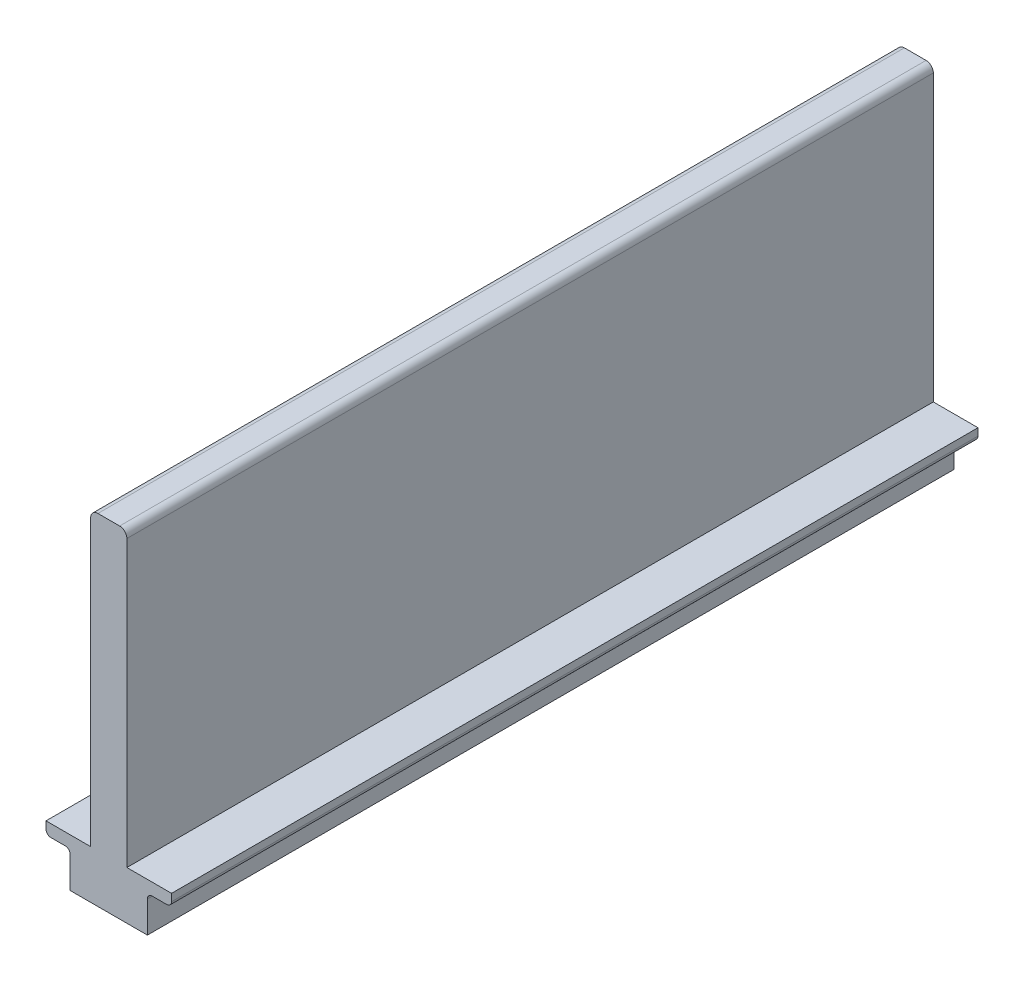
ISO-10303-21;
HEADER;
FILE_DESCRIPTION(('STEP AP214'),'2;1');
FILE_NAME('part.step','',(''),(''),'','','');
FILE_SCHEMA(('AUTOMOTIVE_DESIGN { 1 0 10303 214 1 1 1 1 }'));
ENDSEC;
DATA;
#1=APPLICATION_CONTEXT('core data for automotive mechanical design processes');
#2=APPLICATION_PROTOCOL_DEFINITION('international standard','automotive_design',2000,#1);
#3=PRODUCT_CONTEXT('',#1,'mechanical');
#4=PRODUCT('Part','Part','',(#3));
#5=PRODUCT_RELATED_PRODUCT_CATEGORY('part','',(#4));
#6=PRODUCT_DEFINITION_FORMATION('','',#4);
#7=PRODUCT_DEFINITION_CONTEXT('part definition',#1,'design');
#8=PRODUCT_DEFINITION('design','',#6,#7);
#9=PRODUCT_DEFINITION_SHAPE('','',#8);
#10=(LENGTH_UNIT() NAMED_UNIT(*) SI_UNIT(.MILLI.,.METRE.));
#11=(NAMED_UNIT(*) PLANE_ANGLE_UNIT() SI_UNIT($,.RADIAN.));
#12=(NAMED_UNIT(*) SI_UNIT($,.STERADIAN.) SOLID_ANGLE_UNIT());
#13=UNCERTAINTY_MEASURE_WITH_UNIT(LENGTH_MEASURE(1.E-05),#10,'distance_accuracy_value','');
#14=(GEOMETRIC_REPRESENTATION_CONTEXT(3) GLOBAL_UNCERTAINTY_ASSIGNED_CONTEXT((#13)) GLOBAL_UNIT_ASSIGNED_CONTEXT((#10,
#11,#12)) REPRESENTATION_CONTEXT('',''));
#15=CARTESIAN_POINT('',(0.,0.,0.));
#16=DIRECTION('',(0.,0.,1.));
#17=DIRECTION('',(1.,0.,0.));
#18=AXIS2_PLACEMENT_3D('',#15,#16,#17);
#19=CARTESIAN_POINT('',(-4.191,-0.762,84.981564660483));
#20=DIRECTION('',(0.,0.,-1.));
#21=DIRECTION('',(-1.,0.,0.));
#22=AXIS2_PLACEMENT_3D('',#19,#20,#21);
#23=CYLINDRICAL_SURFACE('',#22,0.508);
#24=CARTESIAN_POINT('',(-4.191,-0.762,84.836));
#25=DIRECTION('',(0.,0.,-1.));
#26=DIRECTION('',(-1.,0.,0.));
#27=AXIS2_PLACEMENT_3D('',#24,#25,#26);
#28=CIRCLE('',#27,0.508);
#29=CARTESIAN_POINT('',(-4.191,-1.27,84.836));
#30=VERTEX_POINT('',#29);
#31=CARTESIAN_POINT('',(-4.699,-0.762,84.836));
#32=VERTEX_POINT('',#31);
#33=EDGE_CURVE('E127',#30,#32,#28,.T.);
#34=ORIENTED_EDGE('',*,*,#33,.T.);
#35=DIRECTION('',(0.,0.,1.));
#36=VECTOR('',#35,1.);
#37=CARTESIAN_POINT('',(-4.699,-0.762,0.));
#38=LINE('',#37,#36);
#39=CARTESIAN_POINT('',(-4.699,-0.762,0.));
#40=VERTEX_POINT('',#39);
#41=EDGE_CURVE('E130',#40,#32,#38,.T.);
#42=ORIENTED_EDGE('',*,*,#41,.F.);
#43=CARTESIAN_POINT('',(-4.191,-0.762,0.));
#44=DIRECTION('',(0.,0.,-1.));
#45=DIRECTION('',(-1.,0.,0.));
#46=AXIS2_PLACEMENT_3D('',#43,#44,#45);
#47=CIRCLE('',#46,0.508);
#48=CARTESIAN_POINT('',(-4.191,-1.27,0.));
#49=VERTEX_POINT('',#48);
#50=EDGE_CURVE('E20',#40,#49,#47,.F.);
#51=ORIENTED_EDGE('',*,*,#50,.T.);
#52=DIRECTION('',(0.,0.,-1.));
#53=VECTOR('',#52,1.);
#54=CARTESIAN_POINT('',(-4.191,-1.27,0.));
#55=LINE('',#54,#53);
#56=EDGE_CURVE('E157',#30,#49,#55,.T.);
#57=ORIENTED_EDGE('',*,*,#56,.F.);
#58=EDGE_LOOP('',(#34,#42,#51,#57));
#59=FACE_BOUND('',#58,.T.);
#60=ADVANCED_FACE('F17',(#59),#23,.T.);
#61=CARTESIAN_POINT('',(-4.699,-1.27,0.));
#62=DIRECTION('',(0.,-1.,0.));
#63=DIRECTION('',(0.,0.,-1.));
#64=AXIS2_PLACEMENT_3D('',#61,#62,#63);
#65=PLANE('',#64);
#66=DIRECTION('',(1.,0.,0.));
#67=VECTOR('',#66,1.);
#68=CARTESIAN_POINT('',(-4.699,-1.27,84.836));
#69=LINE('',#68,#67);
#70=CARTESIAN_POINT('',(-2.667,-1.27,84.836));
#71=VERTEX_POINT('',#70);
#72=EDGE_CURVE('E160',#71,#30,#69,.F.);
#73=ORIENTED_EDGE('',*,*,#72,.T.);
#74=ORIENTED_EDGE('',*,*,#56,.T.);
#75=DIRECTION('',(1.,0.,0.));
#76=VECTOR('',#75,1.);
#77=CARTESIAN_POINT('',(-4.699,-1.27,0.));
#78=LINE('',#77,#76);
#79=CARTESIAN_POINT('',(-2.667,-1.27,0.));
#80=VERTEX_POINT('',#79);
#81=EDGE_CURVE('E123',#49,#80,#78,.T.);
#82=ORIENTED_EDGE('',*,*,#81,.T.);
#83=DIRECTION('',(0.,0.,1.));
#84=VECTOR('',#83,1.);
#85=CARTESIAN_POINT('',(-2.667,-1.27,-0.124377411582246));
#86=LINE('',#85,#84);
#87=EDGE_CURVE('E181',#80,#71,#86,.T.);
#88=ORIENTED_EDGE('',*,*,#87,.T.);
#89=EDGE_LOOP('',(#73,#74,#82,#88));
#90=FACE_BOUND('',#89,.T.);
#91=ADVANCED_FACE('F370',(#90),#65,.T.);
#92=CARTESIAN_POINT('',(5.969,-1.27,0.));
#93=DIRECTION('',(0.,-1.,0.));
#94=DIRECTION('',(0.,0.,-1.));
#95=AXIS2_PLACEMENT_3D('',#92,#93,#94);
#96=PLANE('',#95);
#97=DIRECTION('',(1.,0.,0.));
#98=VECTOR('',#97,1.);
#99=CARTESIAN_POINT('',(5.969,-1.27,0.));
#100=LINE('',#99,#98);
#101=CARTESIAN_POINT('',(6.477,-1.27,0.));
#102=VERTEX_POINT('',#101);
#103=CARTESIAN_POINT('',(8.001,-1.27,0.));
#104=VERTEX_POINT('',#103);
#105=EDGE_CURVE('E187',#102,#104,#100,.T.);
#106=ORIENTED_EDGE('',*,*,#105,.T.);
#107=DIRECTION('',(0.,0.,-1.));
#108=VECTOR('',#107,1.);
#109=CARTESIAN_POINT('',(8.001,-1.27,84.981564660483));
#110=LINE('',#109,#108);
#111=CARTESIAN_POINT('',(8.001,-1.27,84.836));
#112=VERTEX_POINT('',#111);
#113=EDGE_CURVE('E141',#112,#104,#110,.T.);
#114=ORIENTED_EDGE('',*,*,#113,.F.);
#115=DIRECTION('',(1.,0.,0.));
#116=VECTOR('',#115,1.);
#117=CARTESIAN_POINT('',(5.969,-1.27,84.836));
#118=LINE('',#117,#116);
#119=CARTESIAN_POINT('',(6.477,-1.27,84.836));
#120=VERTEX_POINT('',#119);
#121=EDGE_CURVE('E159',#112,#120,#118,.F.);
#122=ORIENTED_EDGE('',*,*,#121,.T.);
#123=DIRECTION('',(0.,0.,1.));
#124=VECTOR('',#123,1.);
#125=CARTESIAN_POINT('',(6.477,-1.27,-0.124377411582246));
#126=LINE('',#125,#124);
#127=EDGE_CURVE('E178',#120,#102,#126,.F.);
#128=ORIENTED_EDGE('',*,*,#127,.T.);
#129=EDGE_LOOP('',(#106,#114,#122,#128));
#130=FACE_BOUND('',#129,.T.);
#131=ADVANCED_FACE('F385',(#130),#96,.T.);
#132=CARTESIAN_POINT('',(8.001,-0.762,84.981564660483));
#133=DIRECTION('',(0.,0.,-1.));
#134=DIRECTION('',(-1.,0.,0.));
#135=AXIS2_PLACEMENT_3D('',#132,#133,#134);
#136=CYLINDRICAL_SURFACE('',#135,0.508);
#137=CARTESIAN_POINT('',(8.001,-0.762,84.836));
#138=DIRECTION('',(0.,0.,-1.));
#139=DIRECTION('',(-1.,0.,0.));
#140=AXIS2_PLACEMENT_3D('',#137,#138,#139);
#141=CIRCLE('',#140,0.508);
#142=CARTESIAN_POINT('',(8.509,-0.762,84.836));
#143=VERTEX_POINT('',#142);
#144=EDGE_CURVE('E156',#143,#112,#141,.T.);
#145=ORIENTED_EDGE('',*,*,#144,.T.);
#146=ORIENTED_EDGE('',*,*,#113,.T.);
#147=CARTESIAN_POINT('',(8.001,-0.762,0.));
#148=DIRECTION('',(0.,0.,-1.));
#149=DIRECTION('',(-1.,0.,0.));
#150=AXIS2_PLACEMENT_3D('',#147,#148,#149);
#151=CIRCLE('',#150,0.508);
#152=CARTESIAN_POINT('',(8.509,-0.762,0.));
#153=VERTEX_POINT('',#152);
#154=EDGE_CURVE('E185',#104,#153,#151,.F.);
#155=ORIENTED_EDGE('',*,*,#154,.T.);
#156=DIRECTION('',(0.,0.,-1.));
#157=VECTOR('',#156,1.);
#158=CARTESIAN_POINT('',(8.509,-0.762,0.));
#159=LINE('',#158,#157);
#160=EDGE_CURVE('E213',#143,#153,#159,.T.);
#161=ORIENTED_EDGE('',*,*,#160,.F.);
#162=EDGE_LOOP('',(#145,#146,#155,#161));
#163=FACE_BOUND('',#162,.T.);
#164=ADVANCED_FACE('F388',(#163),#136,.T.);
#165=CARTESIAN_POINT('',(-4.699,0.,0.));
#166=DIRECTION('',(-1.,0.,0.));
#167=DIRECTION('',(0.,0.,1.));
#168=AXIS2_PLACEMENT_3D('',#165,#166,#167);
#169=PLANE('',#168);
#170=DIRECTION('',(0.,1.,0.));
#171=VECTOR('',#170,1.);
#172=CARTESIAN_POINT('',(-4.699,0.,0.));
#173=LINE('',#172,#171);
#174=CARTESIAN_POINT('',(-4.699,0.,0.));
#175=VERTEX_POINT('',#174);
#176=EDGE_CURVE('E120',#175,#40,#173,.F.);
#177=ORIENTED_EDGE('',*,*,#176,.T.);
#178=ORIENTED_EDGE('',*,*,#41,.T.);
#179=DIRECTION('',(0.,1.,0.));
#180=VECTOR('',#179,1.);
#181=CARTESIAN_POINT('',(-4.699,0.,84.836));
#182=LINE('',#181,#180);
#183=CARTESIAN_POINT('',(-4.699,0.,84.836));
#184=VERTEX_POINT('',#183);
#185=EDGE_CURVE('E139',#32,#184,#182,.T.);
#186=ORIENTED_EDGE('',*,*,#185,.T.);
#187=DIRECTION('',(0.,0.,1.));
#188=VECTOR('',#187,1.);
#189=CARTESIAN_POINT('',(-4.699,0.,0.));
#190=LINE('',#189,#188);
#191=EDGE_CURVE('E137',#175,#184,#190,.T.);
#192=ORIENTED_EDGE('',*,*,#191,.F.);
#193=EDGE_LOOP('',(#177,#178,#186,#192));
#194=FACE_BOUND('',#193,.T.);
#195=ADVANCED_FACE('F135',(#194),#169,.T.);
#196=CARTESIAN_POINT('',(-2.667,-1.778,-0.124377411582246));
#197=DIRECTION('',(0.,0.,1.));
#198=DIRECTION('',(1.,0.,0.));
#199=AXIS2_PLACEMENT_3D('',#196,#197,#198);
#200=CYLINDRICAL_SURFACE('',#199,0.508);
#201=ORIENTED_EDGE('',*,*,#87,.F.);
#202=CARTESIAN_POINT('',(-2.667,-1.778,0.));
#203=DIRECTION('',(0.,0.,1.));
#204=DIRECTION('',(1.,0.,0.));
#205=AXIS2_PLACEMENT_3D('',#202,#203,#204);
#206=CIRCLE('',#205,0.508);
#207=CARTESIAN_POINT('',(-2.159,-1.778,0.));
#208=VERTEX_POINT('',#207);
#209=EDGE_CURVE('E133',#208,#80,#206,.T.);
#210=ORIENTED_EDGE('',*,*,#209,.F.);
#211=DIRECTION('',(0.,0.,1.));
#212=VECTOR('',#211,1.);
#213=CARTESIAN_POINT('',(-2.159,-1.778,0.));
#214=LINE('',#213,#212);
#215=CARTESIAN_POINT('',(-2.159,-1.778,84.836));
#216=VERTEX_POINT('',#215);
#217=EDGE_CURVE('E235',#216,#208,#214,.F.);
#218=ORIENTED_EDGE('',*,*,#217,.F.);
#219=CARTESIAN_POINT('',(-2.667,-1.778,84.836));
#220=DIRECTION('',(0.,0.,1.));
#221=DIRECTION('',(1.,0.,0.));
#222=AXIS2_PLACEMENT_3D('',#219,#220,#221);
#223=CIRCLE('',#222,0.508);
#224=EDGE_CURVE('E179',#71,#216,#223,.F.);
#225=ORIENTED_EDGE('',*,*,#224,.F.);
#226=EDGE_LOOP('',(#201,#210,#218,#225));
#227=FACE_BOUND('',#226,.T.);
#228=ADVANCED_FACE('F374',(#227),#200,.F.);
#229=CARTESIAN_POINT('',(6.477,-1.778,-0.124377411582246));
#230=DIRECTION('',(0.,0.,1.));
#231=DIRECTION('',(1.,0.,0.));
#232=AXIS2_PLACEMENT_3D('',#229,#230,#231);
#233=CYLINDRICAL_SURFACE('',#232,0.508);
#234=DIRECTION('',(0.,0.,-1.));
#235=VECTOR('',#234,1.);
#236=CARTESIAN_POINT('',(5.969,-1.778,0.));
#237=LINE('',#236,#235);
#238=CARTESIAN_POINT('',(5.969,-1.778,0.));
#239=VERTEX_POINT('',#238);
#240=CARTESIAN_POINT('',(5.969,-1.778,84.836));
#241=VERTEX_POINT('',#240);
#242=EDGE_CURVE('E224',#239,#241,#237,.F.);
#243=ORIENTED_EDGE('',*,*,#242,.F.);
#244=CARTESIAN_POINT('',(6.477,-1.778,0.));
#245=DIRECTION('',(0.,0.,1.));
#246=DIRECTION('',(1.,0.,0.));
#247=AXIS2_PLACEMENT_3D('',#244,#245,#246);
#248=CIRCLE('',#247,0.508);
#249=EDGE_CURVE('E176',#102,#239,#248,.T.);
#250=ORIENTED_EDGE('',*,*,#249,.F.);
#251=ORIENTED_EDGE('',*,*,#127,.F.);
#252=CARTESIAN_POINT('',(6.477,-1.778,84.836));
#253=DIRECTION('',(0.,0.,1.));
#254=DIRECTION('',(1.,0.,0.));
#255=AXIS2_PLACEMENT_3D('',#252,#253,#254);
#256=CIRCLE('',#255,0.508);
#257=EDGE_CURVE('E173',#241,#120,#256,.F.);
#258=ORIENTED_EDGE('',*,*,#257,.F.);
#259=EDGE_LOOP('',(#243,#250,#251,#258));
#260=FACE_BOUND('',#259,.T.);
#261=ADVANCED_FACE('F383',(#260),#233,.F.);
#262=CARTESIAN_POINT('',(0.762,29.972,84.9850274449214));
#263=DIRECTION('',(0.,0.,-1.));
#264=DIRECTION('',(-1.,0.,0.));
#265=AXIS2_PLACEMENT_3D('',#262,#263,#264);
#266=CYLINDRICAL_SURFACE('',#265,0.762);
#267=CARTESIAN_POINT('',(0.762,29.972,84.836));
#268=DIRECTION('',(0.,0.,-1.));
#269=DIRECTION('',(-1.,0.,0.));
#270=AXIS2_PLACEMENT_3D('',#267,#268,#269);
#271=CIRCLE('',#270,0.762);
#272=CARTESIAN_POINT('',(0.,29.972,84.836));
#273=VERTEX_POINT('',#272);
#274=CARTESIAN_POINT('',(0.762,30.734,84.836));
#275=VERTEX_POINT('',#274);
#276=EDGE_CURVE('E168',#273,#275,#271,.T.);
#277=ORIENTED_EDGE('',*,*,#276,.T.);
#278=DIRECTION('',(0.,0.,1.));
#279=VECTOR('',#278,1.);
#280=CARTESIAN_POINT('',(0.762,30.734,0.));
#281=LINE('',#280,#279);
#282=CARTESIAN_POINT('',(0.762,30.734,0.));
#283=VERTEX_POINT('',#282);
#284=EDGE_CURVE('E220',#283,#275,#281,.T.);
#285=ORIENTED_EDGE('',*,*,#284,.F.);
#286=CARTESIAN_POINT('',(0.762,29.972,0.));
#287=DIRECTION('',(0.,0.,-1.));
#288=DIRECTION('',(-1.,0.,0.));
#289=AXIS2_PLACEMENT_3D('',#286,#287,#288);
#290=CIRCLE('',#289,0.762);
#291=CARTESIAN_POINT('',(0.,29.972,0.));
#292=VERTEX_POINT('',#291);
#293=EDGE_CURVE('E171',#283,#292,#290,.F.);
#294=ORIENTED_EDGE('',*,*,#293,.T.);
#295=DIRECTION('',(0.,0.,1.));
#296=VECTOR('',#295,1.);
#297=CARTESIAN_POINT('',(0.,29.972,0.));
#298=LINE('',#297,#296);
#299=EDGE_CURVE('E149',#273,#292,#298,.F.);
#300=ORIENTED_EDGE('',*,*,#299,.F.);
#301=EDGE_LOOP('',(#277,#285,#294,#300));
#302=FACE_BOUND('',#301,.T.);
#303=ADVANCED_FACE('F363',(#302),#266,.T.);
#304=CARTESIAN_POINT('',(8.509,-1.27,0.));
#305=DIRECTION('',(1.,0.,0.));
#306=DIRECTION('',(0.,0.,-1.));
#307=AXIS2_PLACEMENT_3D('',#304,#305,#306);
#308=PLANE('',#307);
#309=DIRECTION('',(0.,1.,0.));
#310=VECTOR('',#309,1.);
#311=CARTESIAN_POINT('',(8.509,0.,84.836));
#312=LINE('',#311,#310);
#313=CARTESIAN_POINT('',(8.509,0.,84.836));
#314=VERTEX_POINT('',#313);
#315=EDGE_CURVE('E281',#143,#314,#312,.T.);
#316=ORIENTED_EDGE('',*,*,#315,.F.);
#317=ORIENTED_EDGE('',*,*,#160,.T.);
#318=DIRECTION('',(0.,1.,0.));
#319=VECTOR('',#318,1.);
#320=CARTESIAN_POINT('',(8.509,-1.27,0.));
#321=LINE('',#320,#319);
#322=CARTESIAN_POINT('',(8.509,0.,0.));
#323=VERTEX_POINT('',#322);
#324=EDGE_CURVE('E170',#153,#323,#321,.T.);
#325=ORIENTED_EDGE('',*,*,#324,.T.);
#326=DIRECTION('',(0.,0.,1.));
#327=VECTOR('',#326,1.);
#328=CARTESIAN_POINT('',(8.509,0.,0.));
#329=LINE('',#328,#327);
#330=EDGE_CURVE('E260',#314,#323,#329,.F.);
#331=ORIENTED_EDGE('',*,*,#330,.F.);
#332=EDGE_LOOP('',(#316,#317,#325,#331));
#333=FACE_BOUND('',#332,.T.);
#334=ADVANCED_FACE('F390',(#333),#308,.T.);
#335=CARTESIAN_POINT('',(0.,30.734,0.));
#336=DIRECTION('',(-1.,0.,0.));
#337=DIRECTION('',(0.,0.,1.));
#338=AXIS2_PLACEMENT_3D('',#335,#336,#337);
#339=PLANE('',#338);
#340=DIRECTION('',(0.,1.,0.));
#341=VECTOR('',#340,1.);
#342=CARTESIAN_POINT('',(0.,0.,84.836));
#343=LINE('',#342,#341);
#344=CARTESIAN_POINT('',(0.,0.,84.836));
#345=VERTEX_POINT('',#344);
#346=EDGE_CURVE('E206',#273,#345,#343,.F.);
#347=ORIENTED_EDGE('',*,*,#346,.F.);
#348=ORIENTED_EDGE('',*,*,#299,.T.);
#349=DIRECTION('',(0.,1.,0.));
#350=VECTOR('',#349,1.);
#351=CARTESIAN_POINT('',(0.,0.,0.));
#352=LINE('',#351,#350);
#353=CARTESIAN_POINT('',(0.,0.,0.));
#354=VERTEX_POINT('',#353);
#355=EDGE_CURVE('E230',#292,#354,#352,.F.);
#356=ORIENTED_EDGE('',*,*,#355,.T.);
#357=DIRECTION('',(0.,0.,1.));
#358=VECTOR('',#357,1.);
#359=CARTESIAN_POINT('',(0.,0.,0.));
#360=LINE('',#359,#358);
#361=EDGE_CURVE('E148',#345,#354,#360,.F.);
#362=ORIENTED_EDGE('',*,*,#361,.F.);
#363=EDGE_LOOP('',(#347,#348,#356,#362));
#364=FACE_BOUND('',#363,.T.);
#365=ADVANCED_FACE('F366',(#364),#339,.T.);
#366=CARTESIAN_POINT('',(0.,0.,0.));
#367=DIRECTION('',(0.,1.,0.));
#368=DIRECTION('',(0.,0.,1.));
#369=AXIS2_PLACEMENT_3D('',#366,#367,#368);
#370=PLANE('',#369);
#371=ORIENTED_EDGE('',*,*,#361,.T.);
#372=DIRECTION('',(1.,0.,0.));
#373=VECTOR('',#372,1.);
#374=CARTESIAN_POINT('',(0.,0.,0.));
#375=LINE('',#374,#373);
#376=EDGE_CURVE('E227',#354,#175,#375,.F.);
#377=ORIENTED_EDGE('',*,*,#376,.T.);
#378=ORIENTED_EDGE('',*,*,#191,.T.);
#379=DIRECTION('',(1.,0.,0.));
#380=VECTOR('',#379,1.);
#381=CARTESIAN_POINT('',(0.,0.,84.836));
#382=LINE('',#381,#380);
#383=EDGE_CURVE('E202',#345,#184,#382,.F.);
#384=ORIENTED_EDGE('',*,*,#383,.F.);
#385=EDGE_LOOP('',(#371,#377,#378,#384));
#386=FACE_BOUND('',#385,.T.);
#387=ADVANCED_FACE('F369',(#386),#370,.T.);
#388=CARTESIAN_POINT('',(-2.159,-1.27,0.));
#389=DIRECTION('',(-1.,0.,0.));
#390=DIRECTION('',(0.,0.,1.));
#391=AXIS2_PLACEMENT_3D('',#388,#389,#390);
#392=PLANE('',#391);
#393=DIRECTION('',(0.,1.,0.));
#394=VECTOR('',#393,1.);
#395=CARTESIAN_POINT('',(-2.159,0.,84.836));
#396=LINE('',#395,#394);
#397=CARTESIAN_POINT('',(-2.159,-5.08,84.836));
#398=VERTEX_POINT('',#397);
#399=EDGE_CURVE('E205',#216,#398,#396,.F.);
#400=ORIENTED_EDGE('',*,*,#399,.F.);
#401=ORIENTED_EDGE('',*,*,#217,.T.);
#402=DIRECTION('',(0.,1.,0.));
#403=VECTOR('',#402,1.);
#404=CARTESIAN_POINT('',(-2.159,0.,0.));
#405=LINE('',#404,#403);
#406=CARTESIAN_POINT('',(-2.159,-5.08,0.));
#407=VERTEX_POINT('',#406);
#408=EDGE_CURVE('E229',#208,#407,#405,.F.);
#409=ORIENTED_EDGE('',*,*,#408,.T.);
#410=DIRECTION('',(0.,0.,-1.));
#411=VECTOR('',#410,1.);
#412=CARTESIAN_POINT('',(-2.159,-5.08,0.));
#413=LINE('',#412,#411);
#414=EDGE_CURVE('E240',#398,#407,#413,.T.);
#415=ORIENTED_EDGE('',*,*,#414,.F.);
#416=EDGE_LOOP('',(#400,#401,#409,#415));
#417=FACE_BOUND('',#416,.T.);
#418=ADVANCED_FACE('F378',(#417),#392,.T.);
#419=CARTESIAN_POINT('',(-2.159,-5.08,0.));
#420=DIRECTION('',(0.,-1.,0.));
#421=DIRECTION('',(0.,0.,-1.));
#422=AXIS2_PLACEMENT_3D('',#419,#420,#421);
#423=PLANE('',#422);
#424=ORIENTED_EDGE('',*,*,#414,.T.);
#425=DIRECTION('',(1.,0.,0.));
#426=VECTOR('',#425,1.);
#427=CARTESIAN_POINT('',(0.,-5.08,0.));
#428=LINE('',#427,#426);
#429=CARTESIAN_POINT('',(5.969,-5.08,0.));
#430=VERTEX_POINT('',#429);
#431=EDGE_CURVE('E248',#407,#430,#428,.T.);
#432=ORIENTED_EDGE('',*,*,#431,.T.);
#433=DIRECTION('',(0.,0.,-1.));
#434=VECTOR('',#433,1.);
#435=CARTESIAN_POINT('',(5.969,-5.08,0.));
#436=LINE('',#435,#434);
#437=CARTESIAN_POINT('',(5.969,-5.08,84.836));
#438=VERTEX_POINT('',#437);
#439=EDGE_CURVE('E245',#438,#430,#436,.T.);
#440=ORIENTED_EDGE('',*,*,#439,.F.);
#441=DIRECTION('',(1.,0.,0.));
#442=VECTOR('',#441,1.);
#443=CARTESIAN_POINT('',(0.,-5.08,84.836));
#444=LINE('',#443,#442);
#445=EDGE_CURVE('E209',#398,#438,#444,.T.);
#446=ORIENTED_EDGE('',*,*,#445,.F.);
#447=EDGE_LOOP('',(#424,#432,#440,#446));
#448=FACE_BOUND('',#447,.T.);
#449=ADVANCED_FACE('F379',(#448),#423,.T.);
#450=CARTESIAN_POINT('',(5.969,-5.08,0.));
#451=DIRECTION('',(1.,0.,0.));
#452=DIRECTION('',(0.,0.,-1.));
#453=AXIS2_PLACEMENT_3D('',#450,#451,#452);
#454=PLANE('',#453);
#455=DIRECTION('',(0.,1.,0.));
#456=VECTOR('',#455,1.);
#457=CARTESIAN_POINT('',(5.969,0.,0.));
#458=LINE('',#457,#456);
#459=EDGE_CURVE('E251',#430,#239,#458,.T.);
#460=ORIENTED_EDGE('',*,*,#459,.T.);
#461=ORIENTED_EDGE('',*,*,#242,.T.);
#462=DIRECTION('',(0.,1.,0.));
#463=VECTOR('',#462,1.);
#464=CARTESIAN_POINT('',(5.969,0.,84.836));
#465=LINE('',#464,#463);
#466=EDGE_CURVE('E212',#438,#241,#465,.T.);
#467=ORIENTED_EDGE('',*,*,#466,.F.);
#468=ORIENTED_EDGE('',*,*,#439,.T.);
#469=EDGE_LOOP('',(#460,#461,#467,#468));
#470=FACE_BOUND('',#469,.T.);
#471=ADVANCED_FACE('F321',(#470),#454,.T.);
#472=CARTESIAN_POINT('',(3.81,30.734,0.));
#473=DIRECTION('',(0.,1.,0.));
#474=DIRECTION('',(0.,0.,1.));
#475=AXIS2_PLACEMENT_3D('',#472,#473,#474);
#476=PLANE('',#475);
#477=DIRECTION('',(1.,0.,0.));
#478=VECTOR('',#477,1.);
#479=CARTESIAN_POINT('',(0.,30.734,84.836));
#480=LINE('',#479,#478);
#481=CARTESIAN_POINT('',(3.048,30.734,84.836));
#482=VERTEX_POINT('',#481);
#483=EDGE_CURVE('E223',#482,#275,#480,.F.);
#484=ORIENTED_EDGE('',*,*,#483,.F.);
#485=DIRECTION('',(0.,0.,-1.));
#486=VECTOR('',#485,1.);
#487=CARTESIAN_POINT('',(3.048,30.734,84.9850274449214));
#488=LINE('',#487,#486);
#489=CARTESIAN_POINT('',(3.048,30.734,0.));
#490=VERTEX_POINT('',#489);
#491=EDGE_CURVE('E165',#490,#482,#488,.F.);
#492=ORIENTED_EDGE('',*,*,#491,.F.);
#493=DIRECTION('',(1.,0.,0.));
#494=VECTOR('',#493,1.);
#495=CARTESIAN_POINT('',(0.,30.734,0.));
#496=LINE('',#495,#494);
#497=EDGE_CURVE('E263',#490,#283,#496,.F.);
#498=ORIENTED_EDGE('',*,*,#497,.T.);
#499=ORIENTED_EDGE('',*,*,#284,.T.);
#500=EDGE_LOOP('',(#484,#492,#498,#499));
#501=FACE_BOUND('',#500,.T.);
#502=ADVANCED_FACE('F413',(#501),#476,.T.);
#503=CARTESIAN_POINT('',(0.,0.,84.836));
#504=DIRECTION('',(0.,0.,1.));
#505=DIRECTION('',(1.,0.,0.));
#506=AXIS2_PLACEMENT_3D('',#503,#504,#505);
#507=PLANE('',#506);
#508=DIRECTION('',(0.,1.,0.));
#509=VECTOR('',#508,1.);
#510=CARTESIAN_POINT('',(3.81,0.,84.836));
#511=LINE('',#510,#509);
#512=CARTESIAN_POINT('',(3.81,29.972,84.836));
#513=VERTEX_POINT('',#512);
#514=CARTESIAN_POINT('',(3.81,0.,84.836));
#515=VERTEX_POINT('',#514);
#516=EDGE_CURVE('E164',#513,#515,#511,.F.);
#517=ORIENTED_EDGE('',*,*,#516,.F.);
#518=CARTESIAN_POINT('',(3.048,29.972,84.836));
#519=DIRECTION('',(0.,0.,-1.));
#520=DIRECTION('',(-1.,0.,0.));
#521=AXIS2_PLACEMENT_3D('',#518,#519,#520);
#522=CIRCLE('',#521,0.762);
#523=EDGE_CURVE('E161',#482,#513,#522,.T.);
#524=ORIENTED_EDGE('',*,*,#523,.F.);
#525=ORIENTED_EDGE('',*,*,#483,.T.);
#526=ORIENTED_EDGE('',*,*,#276,.F.);
#527=ORIENTED_EDGE('',*,*,#346,.T.);
#528=ORIENTED_EDGE('',*,*,#383,.T.);
#529=ORIENTED_EDGE('',*,*,#185,.F.);
#530=ORIENTED_EDGE('',*,*,#33,.F.);
#531=ORIENTED_EDGE('',*,*,#72,.F.);
#532=ORIENTED_EDGE('',*,*,#224,.T.);
#533=ORIENTED_EDGE('',*,*,#399,.T.);
#534=ORIENTED_EDGE('',*,*,#445,.T.);
#535=ORIENTED_EDGE('',*,*,#466,.T.);
#536=ORIENTED_EDGE('',*,*,#257,.T.);
#537=ORIENTED_EDGE('',*,*,#121,.F.);
#538=ORIENTED_EDGE('',*,*,#144,.F.);
#539=ORIENTED_EDGE('',*,*,#315,.T.);
#540=DIRECTION('',(1.,0.,0.));
#541=VECTOR('',#540,1.);
#542=CARTESIAN_POINT('',(8.509,0.,84.836));
#543=LINE('',#542,#541);
#544=EDGE_CURVE('E264',#515,#314,#543,.T.);
#545=ORIENTED_EDGE('',*,*,#544,.F.);
#546=EDGE_LOOP('',(#517,#524,#525,#526,#527,#528,#529,#530,#531,#532,#533,#534,#535,#536,#537,
#538,#539,#545));
#547=FACE_BOUND('',#546,.T.);
#548=ADVANCED_FACE('F350',(#547),#507,.T.);
#549=CARTESIAN_POINT('',(8.509,0.,0.));
#550=DIRECTION('',(0.,1.,0.));
#551=DIRECTION('',(0.,0.,1.));
#552=AXIS2_PLACEMENT_3D('',#549,#550,#551);
#553=PLANE('',#552);
#554=ORIENTED_EDGE('',*,*,#330,.T.);
#555=DIRECTION('',(1.,0.,0.));
#556=VECTOR('',#555,1.);
#557=CARTESIAN_POINT('',(0.,0.,0.));
#558=LINE('',#557,#556);
#559=CARTESIAN_POINT('',(3.81,0.,0.));
#560=VERTEX_POINT('',#559);
#561=EDGE_CURVE('E167',#323,#560,#558,.F.);
#562=ORIENTED_EDGE('',*,*,#561,.T.);
#563=DIRECTION('',(0.,0.,-1.));
#564=VECTOR('',#563,1.);
#565=CARTESIAN_POINT('',(3.81,0.,0.));
#566=LINE('',#565,#564);
#567=EDGE_CURVE('E290',#515,#560,#566,.T.);
#568=ORIENTED_EDGE('',*,*,#567,.F.);
#569=ORIENTED_EDGE('',*,*,#544,.T.);
#570=EDGE_LOOP('',(#554,#562,#568,#569));
#571=FACE_BOUND('',#570,.T.);
#572=ADVANCED_FACE('F354',(#571),#553,.T.);
#573=CARTESIAN_POINT('',(0.,0.,0.));
#574=DIRECTION('',(0.,0.,1.));
#575=DIRECTION('',(1.,0.,0.));
#576=AXIS2_PLACEMENT_3D('',#573,#574,#575);
#577=PLANE('',#576);
#578=ORIENTED_EDGE('',*,*,#561,.F.);
#579=ORIENTED_EDGE('',*,*,#324,.F.);
#580=ORIENTED_EDGE('',*,*,#154,.F.);
#581=ORIENTED_EDGE('',*,*,#105,.F.);
#582=ORIENTED_EDGE('',*,*,#249,.T.);
#583=ORIENTED_EDGE('',*,*,#459,.F.);
#584=ORIENTED_EDGE('',*,*,#431,.F.);
#585=ORIENTED_EDGE('',*,*,#408,.F.);
#586=ORIENTED_EDGE('',*,*,#209,.T.);
#587=ORIENTED_EDGE('',*,*,#81,.F.);
#588=ORIENTED_EDGE('',*,*,#50,.F.);
#589=ORIENTED_EDGE('',*,*,#176,.F.);
#590=ORIENTED_EDGE('',*,*,#376,.F.);
#591=ORIENTED_EDGE('',*,*,#355,.F.);
#592=ORIENTED_EDGE('',*,*,#293,.F.);
#593=ORIENTED_EDGE('',*,*,#497,.F.);
#594=CARTESIAN_POINT('',(3.048,29.972,0.));
#595=DIRECTION('',(0.,0.,-1.));
#596=DIRECTION('',(-1.,0.,0.));
#597=AXIS2_PLACEMENT_3D('',#594,#595,#596);
#598=CIRCLE('',#597,0.762);
#599=CARTESIAN_POINT('',(3.81,29.972,0.));
#600=VERTEX_POINT('',#599);
#601=EDGE_CURVE('E35',#600,#490,#598,.F.);
#602=ORIENTED_EDGE('',*,*,#601,.F.);
#603=DIRECTION('',(0.,1.,0.));
#604=VECTOR('',#603,1.);
#605=CARTESIAN_POINT('',(3.81,0.,0.));
#606=LINE('',#605,#604);
#607=EDGE_CURVE('E26',#560,#600,#606,.T.);
#608=ORIENTED_EDGE('',*,*,#607,.F.);
#609=EDGE_LOOP('',(#578,#579,#580,#581,#582,#583,#584,#585,#586,#587,#588,#589,#590,#591,#592,
#593,#602,#608));
#610=FACE_BOUND('',#609,.T.);
#611=ADVANCED_FACE('F117',(#610),#577,.F.);
#612=CARTESIAN_POINT('',(3.048,29.972,84.9850274449214));
#613=DIRECTION('',(0.,0.,-1.));
#614=DIRECTION('',(-1.,0.,0.));
#615=AXIS2_PLACEMENT_3D('',#612,#613,#614);
#616=CYLINDRICAL_SURFACE('',#615,0.762);
#617=ORIENTED_EDGE('',*,*,#523,.T.);
#618=DIRECTION('',(0.,0.,-1.));
#619=VECTOR('',#618,1.);
#620=CARTESIAN_POINT('',(3.81,29.972,0.));
#621=LINE('',#620,#619);
#622=EDGE_CURVE('E11',#600,#513,#621,.F.);
#623=ORIENTED_EDGE('',*,*,#622,.F.);
#624=ORIENTED_EDGE('',*,*,#601,.T.);
#625=ORIENTED_EDGE('',*,*,#491,.T.);
#626=EDGE_LOOP('',(#617,#623,#624,#625));
#627=FACE_BOUND('',#626,.T.);
#628=ADVANCED_FACE('F358',(#627),#616,.T.);
#629=CARTESIAN_POINT('',(3.81,0.,0.));
#630=DIRECTION('',(1.,0.,0.));
#631=DIRECTION('',(0.,0.,-1.));
#632=AXIS2_PLACEMENT_3D('',#629,#630,#631);
#633=PLANE('',#632);
#634=ORIENTED_EDGE('',*,*,#607,.T.);
#635=ORIENTED_EDGE('',*,*,#622,.T.);
#636=ORIENTED_EDGE('',*,*,#516,.T.);
#637=ORIENTED_EDGE('',*,*,#567,.T.);
#638=EDGE_LOOP('',(#634,#635,#636,#637));
#639=FACE_BOUND('',#638,.T.);
#640=ADVANCED_FACE('F356',(#639),#633,.T.);
#641=CLOSED_SHELL('',(#60,#91,#131,#164,#195,#228,#261,#303,#334,#365,#387,#418,#449,#471,#502,
#548,#572,#611,#628,#640));
#642=MANIFOLD_SOLID_BREP('B1',#641);
#643=ADVANCED_BREP_SHAPE_REPRESENTATION('',(#18,#642),#14);
#644=SHAPE_DEFINITION_REPRESENTATION(#9,#643);
ENDSEC;
END-ISO-10303-21;
